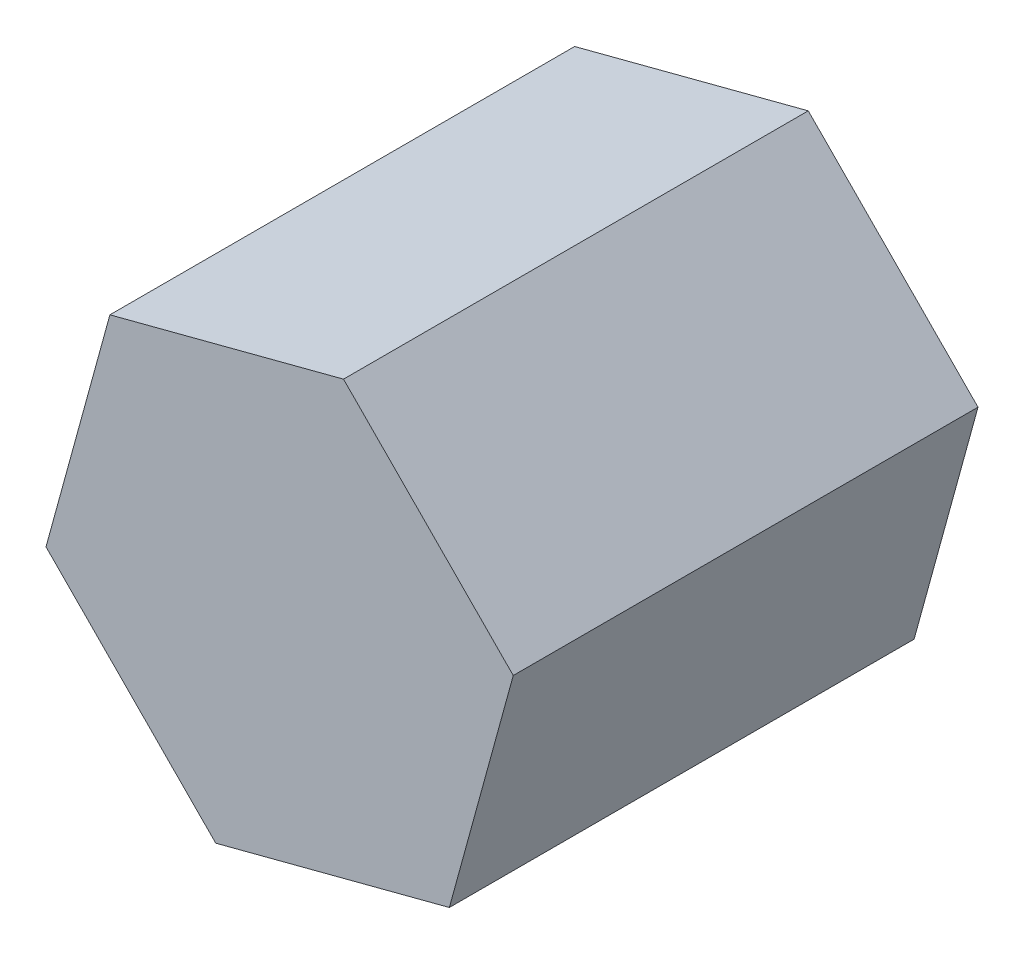
ISO-10303-21;
HEADER;
FILE_DESCRIPTION(('STEP AP214'),'2;1');
FILE_NAME('part.step','',(''),(''),'','','');
FILE_SCHEMA(('AUTOMOTIVE_DESIGN { 1 0 10303 214 1 1 1 1 }'));
ENDSEC;
DATA;
#1=APPLICATION_CONTEXT('core data for automotive mechanical design processes');
#2=APPLICATION_PROTOCOL_DEFINITION('international standard','automotive_design',2000,#1);
#3=PRODUCT_CONTEXT('',#1,'mechanical');
#4=PRODUCT('Part','Part','',(#3));
#5=PRODUCT_RELATED_PRODUCT_CATEGORY('part','',(#4));
#6=PRODUCT_DEFINITION_FORMATION('','',#4);
#7=PRODUCT_DEFINITION_CONTEXT('part definition',#1,'design');
#8=PRODUCT_DEFINITION('design','',#6,#7);
#9=PRODUCT_DEFINITION_SHAPE('','',#8);
#10=(LENGTH_UNIT() NAMED_UNIT(*) SI_UNIT(.MILLI.,.METRE.));
#11=(NAMED_UNIT(*) PLANE_ANGLE_UNIT() SI_UNIT($,.RADIAN.));
#12=(NAMED_UNIT(*) SI_UNIT($,.STERADIAN.) SOLID_ANGLE_UNIT());
#13=UNCERTAINTY_MEASURE_WITH_UNIT(LENGTH_MEASURE(1.E-05),#10,'distance_accuracy_value','');
#14=(GEOMETRIC_REPRESENTATION_CONTEXT(3) GLOBAL_UNCERTAINTY_ASSIGNED_CONTEXT((#13)) GLOBAL_UNIT_ASSIGNED_CONTEXT((#10,
#11,#12)) REPRESENTATION_CONTEXT('',''));
#15=CARTESIAN_POINT('',(0.,0.,0.));
#16=DIRECTION('',(0.,0.,1.));
#17=DIRECTION('',(1.,0.,0.));
#18=AXIS2_PLACEMENT_3D('',#15,#16,#17);
#19=CARTESIAN_POINT('',(106.848964175901,-32.7292318468915,6.));
#20=DIRECTION('',(-0.711328342402235,-0.70285986462117,0.));
#21=DIRECTION('',(0.70285986462117,-0.711328342402235,0.));
#22=AXIS2_PLACEMENT_3D('',#19,#20,#21);
#23=PLANE('',#22);
#24=DIRECTION('',(-0.702859864621169,0.711328342402235,0.));
#25=VECTOR('',#24,1.);
#26=CARTESIAN_POINT('',(106.848964175901,-32.7292318468915,0.));
#27=LINE('',#26,#25);
#28=CARTESIAN_POINT('',(106.848964175901,-32.7292318468915,0.));
#29=VERTEX_POINT('',#28);
#30=CARTESIAN_POINT('',(104.657663982876,-30.5115295530635,0.));
#31=VERTEX_POINT('',#30);
#32=EDGE_CURVE('E117',#29,#31,#27,.T.);
#33=ORIENTED_EDGE('',*,*,#32,.T.);
#34=DIRECTION('',(0.,0.,-1.));
#35=VECTOR('',#34,1.);
#36=CARTESIAN_POINT('',(104.657663982876,-30.5115295530635,6.));
#37=LINE('',#36,#35);
#38=CARTESIAN_POINT('',(104.657663982876,-30.5115295530635,6.));
#39=VERTEX_POINT('',#38);
#40=EDGE_CURVE('E11',#39,#31,#37,.T.);
#41=ORIENTED_EDGE('',*,*,#40,.F.);
#42=DIRECTION('',(-0.702859864621169,0.711328342402235,0.));
#43=VECTOR('',#42,1.);
#44=CARTESIAN_POINT('',(106.848964175901,-32.7292318468915,6.));
#45=LINE('',#44,#43);
#46=CARTESIAN_POINT('',(106.848964175901,-32.7292318468915,6.));
#47=VERTEX_POINT('',#46);
#48=EDGE_CURVE('E127',#47,#39,#45,.T.);
#49=ORIENTED_EDGE('',*,*,#48,.F.);
#50=DIRECTION('',(0.,0.,-1.));
#51=VECTOR('',#50,1.);
#52=CARTESIAN_POINT('',(106.848964175901,-32.7292318468915,6.));
#53=LINE('',#52,#51);
#54=EDGE_CURVE('E113',#47,#29,#53,.T.);
#55=ORIENTED_EDGE('',*,*,#54,.T.);
#56=EDGE_LOOP('',(#33,#41,#49,#55));
#57=FACE_BOUND('',#56,.T.);
#58=ADVANCED_FACE('F33',(#57),#23,.F.);
#59=CARTESIAN_POINT('',(104.657663982876,-30.5115295530635,6.));
#60=DIRECTION('',(0.253030326861307,-0.967458347262796,0.));
#61=DIRECTION('',(0.967458347262796,0.253030326861307,0.));
#62=AXIS2_PLACEMENT_3D('',#59,#60,#61);
#63=PLANE('',#62);
#64=DIRECTION('',(-0.967458347262796,-0.253030326861307,0.));
#65=VECTOR('',#64,1.);
#66=CARTESIAN_POINT('',(104.657663982876,-30.5115295530635,0.));
#67=LINE('',#66,#65);
#68=CARTESIAN_POINT('',(101.641427361878,-31.3004000406267,0.));
#69=VERTEX_POINT('',#68);
#70=EDGE_CURVE('E120',#31,#69,#67,.T.);
#71=ORIENTED_EDGE('',*,*,#70,.T.);
#72=DIRECTION('',(0.,0.,-1.));
#73=VECTOR('',#72,1.);
#74=CARTESIAN_POINT('',(101.641427361878,-31.3004000406267,6.));
#75=LINE('',#74,#73);
#76=CARTESIAN_POINT('',(101.641427361878,-31.3004000406267,6.));
#77=VERTEX_POINT('',#76);
#78=EDGE_CURVE('E41',#77,#69,#75,.T.);
#79=ORIENTED_EDGE('',*,*,#78,.F.);
#80=DIRECTION('',(-0.967458347262796,-0.253030326861307,0.));
#81=VECTOR('',#80,1.);
#82=CARTESIAN_POINT('',(104.657663982876,-30.5115295530635,6.));
#83=LINE('',#82,#81);
#84=EDGE_CURVE('E86',#39,#77,#83,.T.);
#85=ORIENTED_EDGE('',*,*,#84,.F.);
#86=ORIENTED_EDGE('',*,*,#40,.T.);
#87=EDGE_LOOP('',(#71,#79,#85,#86));
#88=FACE_BOUND('',#87,.T.);
#89=ADVANCED_FACE('F151',(#88),#63,.F.);
#90=CARTESIAN_POINT('',(101.641427361878,-31.3004000406267,6.));
#91=DIRECTION('',(0.964358669263541,-0.264598482641629,0.));
#92=DIRECTION('',(0.264598482641629,0.964358669263541,0.));
#93=AXIS2_PLACEMENT_3D('',#90,#91,#92);
#94=PLANE('',#93);
#95=DIRECTION('',(-0.264598482641629,-0.964358669263541,0.));
#96=VECTOR('',#95,1.);
#97=CARTESIAN_POINT('',(101.641427361878,-31.3004000406267,0.));
#98=LINE('',#97,#96);
#99=CARTESIAN_POINT('',(100.816490933904,-34.3069728220178,0.));
#100=VERTEX_POINT('',#99);
#101=EDGE_CURVE('E122',#69,#100,#98,.T.);
#102=ORIENTED_EDGE('',*,*,#101,.T.);
#103=DIRECTION('',(0.,0.,-1.));
#104=VECTOR('',#103,1.);
#105=CARTESIAN_POINT('',(100.816490933904,-34.3069728220178,6.));
#106=LINE('',#105,#104);
#107=CARTESIAN_POINT('',(100.816490933904,-34.3069728220178,6.));
#108=VERTEX_POINT('',#107);
#109=EDGE_CURVE('E108',#108,#100,#106,.T.);
#110=ORIENTED_EDGE('',*,*,#109,.F.);
#111=DIRECTION('',(-0.264598482641629,-0.964358669263541,0.));
#112=VECTOR('',#111,1.);
#113=CARTESIAN_POINT('',(101.641427361878,-31.3004000406267,6.));
#114=LINE('',#113,#112);
#115=EDGE_CURVE('E99',#77,#108,#114,.T.);
#116=ORIENTED_EDGE('',*,*,#115,.F.);
#117=ORIENTED_EDGE('',*,*,#78,.T.);
#118=EDGE_LOOP('',(#102,#110,#116,#117));
#119=FACE_BOUND('',#118,.T.);
#120=ADVANCED_FACE('F133',(#119),#94,.F.);
#121=CARTESIAN_POINT('',(100.816490933904,-34.3069728220178,6.));
#122=DIRECTION('',(0.711328342402235,0.702859864621169,0.));
#123=DIRECTION('',(-0.702859864621169,0.711328342402236,0.));
#124=AXIS2_PLACEMENT_3D('',#121,#122,#123);
#125=PLANE('',#124);
#126=DIRECTION('',(0.702859864621169,-0.711328342402236,0.));
#127=VECTOR('',#126,1.);
#128=CARTESIAN_POINT('',(100.816490933904,-34.3069728220178,0.));
#129=LINE('',#128,#127);
#130=CARTESIAN_POINT('',(103.007791126929,-36.5246751158457,0.));
#131=VERTEX_POINT('',#130);
#132=EDGE_CURVE('E107',#100,#131,#129,.T.);
#133=ORIENTED_EDGE('',*,*,#132,.T.);
#134=DIRECTION('',(0.,0.,-1.));
#135=VECTOR('',#134,1.);
#136=CARTESIAN_POINT('',(103.007791126929,-36.5246751158457,6.));
#137=LINE('',#136,#135);
#138=CARTESIAN_POINT('',(103.007791126929,-36.5246751158457,6.));
#139=VERTEX_POINT('',#138);
#140=EDGE_CURVE('E104',#139,#131,#137,.T.);
#141=ORIENTED_EDGE('',*,*,#140,.F.);
#142=DIRECTION('',(0.702859864621169,-0.711328342402236,0.));
#143=VECTOR('',#142,1.);
#144=CARTESIAN_POINT('',(100.816490933904,-34.3069728220178,6.));
#145=LINE('',#144,#143);
#146=EDGE_CURVE('E93',#108,#139,#145,.T.);
#147=ORIENTED_EDGE('',*,*,#146,.F.);
#148=ORIENTED_EDGE('',*,*,#109,.T.);
#149=EDGE_LOOP('',(#133,#141,#147,#148));
#150=FACE_BOUND('',#149,.T.);
#151=ADVANCED_FACE('F105',(#150),#125,.F.);
#152=CARTESIAN_POINT('',(103.007791126929,-36.5246751158457,6.));
#153=DIRECTION('',(-0.253030326861304,0.967458347262796,0.));
#154=DIRECTION('',(-0.967458347262797,-0.253030326861304,0.));
#155=AXIS2_PLACEMENT_3D('',#152,#153,#154);
#156=PLANE('',#155);
#157=DIRECTION('',(0.967458347262797,0.253030326861304,0.));
#158=VECTOR('',#157,1.);
#159=CARTESIAN_POINT('',(103.007791126929,-36.5246751158457,0.));
#160=LINE('',#159,#158);
#161=CARTESIAN_POINT('',(106.024027747927,-35.7358046282826,0.));
#162=VERTEX_POINT('',#161);
#163=EDGE_CURVE('E72',#131,#162,#160,.T.);
#164=ORIENTED_EDGE('',*,*,#163,.T.);
#165=DIRECTION('',(0.,0.,-1.));
#166=VECTOR('',#165,1.);
#167=CARTESIAN_POINT('',(106.024027747927,-35.7358046282826,6.));
#168=LINE('',#167,#166);
#169=CARTESIAN_POINT('',(106.024027747927,-35.7358046282826,6.));
#170=VERTEX_POINT('',#169);
#171=EDGE_CURVE('E109',#170,#162,#168,.T.);
#172=ORIENTED_EDGE('',*,*,#171,.F.);
#173=DIRECTION('',(0.967458347262797,0.253030326861304,0.));
#174=VECTOR('',#173,1.);
#175=CARTESIAN_POINT('',(103.007791126929,-36.5246751158457,6.));
#176=LINE('',#175,#174);
#177=EDGE_CURVE('E97',#139,#170,#176,.T.);
#178=ORIENTED_EDGE('',*,*,#177,.F.);
#179=ORIENTED_EDGE('',*,*,#140,.T.);
#180=EDGE_LOOP('',(#164,#172,#178,#179));
#181=FACE_BOUND('',#180,.T.);
#182=ADVANCED_FACE('F111',(#181),#156,.F.);
#183=CARTESIAN_POINT('',(106.024027747927,-35.7358046282826,6.));
#184=DIRECTION('',(-0.964358669263542,0.264598482641625,0.));
#185=DIRECTION('',(-0.264598482641625,-0.964358669263542,0.));
#186=AXIS2_PLACEMENT_3D('',#183,#184,#185);
#187=PLANE('',#186);
#188=DIRECTION('',(0.264598482641625,0.964358669263542,0.));
#189=VECTOR('',#188,1.);
#190=CARTESIAN_POINT('',(106.024027747927,-35.7358046282826,0.));
#191=LINE('',#190,#189);
#192=EDGE_CURVE('E78',#162,#29,#191,.T.);
#193=ORIENTED_EDGE('',*,*,#192,.T.);
#194=ORIENTED_EDGE('',*,*,#54,.F.);
#195=DIRECTION('',(0.264598482641625,0.964358669263542,0.));
#196=VECTOR('',#195,1.);
#197=CARTESIAN_POINT('',(106.024027747927,-35.7358046282826,6.));
#198=LINE('',#197,#196);
#199=EDGE_CURVE('E49',#170,#47,#198,.T.);
#200=ORIENTED_EDGE('',*,*,#199,.F.);
#201=ORIENTED_EDGE('',*,*,#171,.T.);
#202=EDGE_LOOP('',(#193,#194,#200,#201));
#203=FACE_BOUND('',#202,.T.);
#204=ADVANCED_FACE('F140',(#203),#187,.F.);
#205=CARTESIAN_POINT('',(0.,0.,6.));
#206=DIRECTION('',(0.,0.,1.));
#207=DIRECTION('',(1.,0.,0.));
#208=AXIS2_PLACEMENT_3D('',#205,#206,#207);
#209=PLANE('',#208);
#210=ORIENTED_EDGE('',*,*,#48,.T.);
#211=ORIENTED_EDGE('',*,*,#84,.T.);
#212=ORIENTED_EDGE('',*,*,#115,.T.);
#213=ORIENTED_EDGE('',*,*,#146,.T.);
#214=ORIENTED_EDGE('',*,*,#177,.T.);
#215=ORIENTED_EDGE('',*,*,#199,.T.);
#216=EDGE_LOOP('',(#210,#211,#212,#213,#214,#215));
#217=FACE_BOUND('',#216,.T.);
#218=ADVANCED_FACE('F95',(#217),#209,.T.);
#219=CARTESIAN_POINT('',(0.,0.,0.));
#220=DIRECTION('',(0.,0.,1.));
#221=DIRECTION('',(1.,0.,0.));
#222=AXIS2_PLACEMENT_3D('',#219,#220,#221);
#223=PLANE('',#222);
#224=ORIENTED_EDGE('',*,*,#32,.F.);
#225=ORIENTED_EDGE('',*,*,#192,.F.);
#226=ORIENTED_EDGE('',*,*,#163,.F.);
#227=ORIENTED_EDGE('',*,*,#132,.F.);
#228=ORIENTED_EDGE('',*,*,#101,.F.);
#229=ORIENTED_EDGE('',*,*,#70,.F.);
#230=EDGE_LOOP('',(#224,#225,#226,#227,#228,#229));
#231=FACE_BOUND('',#230,.T.);
#232=ADVANCED_FACE('F136',(#231),#223,.F.);
#233=CLOSED_SHELL('',(#58,#89,#120,#151,#182,#204,#218,#232));
#234=MANIFOLD_SOLID_BREP('B2',#233);
#235=ADVANCED_BREP_SHAPE_REPRESENTATION('',(#18,#234),#14);
#236=SHAPE_DEFINITION_REPRESENTATION(#9,#235);
ENDSEC;
END-ISO-10303-21;
